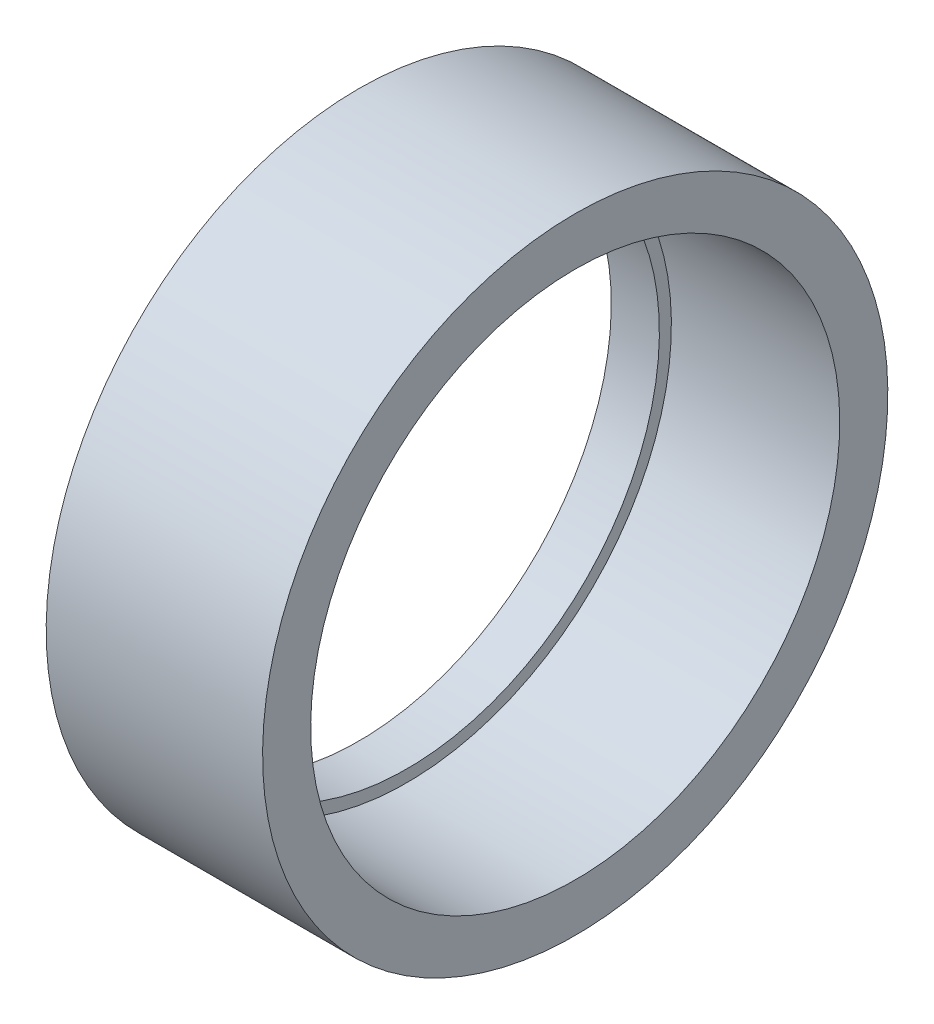
ISO-10303-21;
HEADER;
FILE_DESCRIPTION(('STEP AP214'),'2;1');
FILE_NAME('part.step','',(''),(''),'','','');
FILE_SCHEMA(('AUTOMOTIVE_DESIGN { 1 0 10303 214 1 1 1 1 }'));
ENDSEC;
DATA;
#1=APPLICATION_CONTEXT('core data for automotive mechanical design processes');
#2=APPLICATION_PROTOCOL_DEFINITION('international standard','automotive_design',2000,#1);
#3=PRODUCT_CONTEXT('',#1,'mechanical');
#4=PRODUCT('Part','Part','',(#3));
#5=PRODUCT_RELATED_PRODUCT_CATEGORY('part','',(#4));
#6=PRODUCT_DEFINITION_FORMATION('','',#4);
#7=PRODUCT_DEFINITION_CONTEXT('part definition',#1,'design');
#8=PRODUCT_DEFINITION('design','',#6,#7);
#9=PRODUCT_DEFINITION_SHAPE('','',#8);
#10=(LENGTH_UNIT() NAMED_UNIT(*) SI_UNIT(.MILLI.,.METRE.));
#11=(NAMED_UNIT(*) PLANE_ANGLE_UNIT() SI_UNIT($,.RADIAN.));
#12=(NAMED_UNIT(*) SI_UNIT($,.STERADIAN.) SOLID_ANGLE_UNIT());
#13=UNCERTAINTY_MEASURE_WITH_UNIT(LENGTH_MEASURE(1.E-05),#10,'distance_accuracy_value','');
#14=(GEOMETRIC_REPRESENTATION_CONTEXT(3) GLOBAL_UNCERTAINTY_ASSIGNED_CONTEXT((#13)) GLOBAL_UNIT_ASSIGNED_CONTEXT((#10,
#11,#12)) REPRESENTATION_CONTEXT('',''));
#15=CARTESIAN_POINT('',(0.,0.,0.));
#16=DIRECTION('',(0.,0.,1.));
#17=DIRECTION('',(1.,0.,0.));
#18=AXIS2_PLACEMENT_3D('',#15,#16,#17);
#19=CARTESIAN_POINT('',(0.,0.,0.));
#20=DIRECTION('',(1.,0.,0.));
#21=DIRECTION('',(0.,1.,0.));
#22=AXIS2_PLACEMENT_3D('',#19,#20,#21);
#23=CYLINDRICAL_SURFACE('',#22,11.);
#24=CARTESIAN_POINT('',(0.,0.,0.));
#25=DIRECTION('',(1.,0.,0.));
#26=DIRECTION('',(0.,1.,0.));
#27=AXIS2_PLACEMENT_3D('',#24,#25,#26);
#28=CIRCLE('',#27,11.);
#29=CARTESIAN_POINT('',(0.,11.,0.));
#30=VERTEX_POINT('',#29);
#31=EDGE_CURVE('E10',#30,#30,#28,.T.);
#32=ORIENTED_EDGE('',*,*,#31,.T.);
#33=EDGE_LOOP('',(#32));
#34=FACE_BOUND('',#33,.T.);
#35=CARTESIAN_POINT('',(-7.,0.,0.));
#36=DIRECTION('',(1.,0.,0.));
#37=DIRECTION('',(0.,1.,0.));
#38=AXIS2_PLACEMENT_3D('',#35,#36,#37);
#39=CIRCLE('',#38,11.);
#40=CARTESIAN_POINT('',(-7.,11.,0.));
#41=VERTEX_POINT('',#40);
#42=EDGE_CURVE('E68',#41,#41,#39,.T.);
#43=ORIENTED_EDGE('',*,*,#42,.F.);
#44=EDGE_LOOP('',(#43));
#45=FACE_BOUND('',#44,.T.);
#46=ADVANCED_FACE('F41',(#34,#45),#23,.F.);
#47=CARTESIAN_POINT('',(0.,11.,0.));
#48=DIRECTION('',(1.,0.,0.));
#49=DIRECTION('',(0.,1.,0.));
#50=AXIS2_PLACEMENT_3D('',#47,#48,#49);
#51=PLANE('',#50);
#52=CARTESIAN_POINT('',(0.,0.,0.));
#53=DIRECTION('',(1.,0.,0.));
#54=DIRECTION('',(0.,1.,0.));
#55=AXIS2_PLACEMENT_3D('',#52,#53,#54);
#56=CIRCLE('',#55,13.);
#57=CARTESIAN_POINT('',(0.,13.,0.));
#58=VERTEX_POINT('',#57);
#59=EDGE_CURVE('E48',#58,#58,#56,.T.);
#60=ORIENTED_EDGE('',*,*,#59,.T.);
#61=EDGE_LOOP('',(#60));
#62=FACE_BOUND('',#61,.T.);
#63=ORIENTED_EDGE('',*,*,#31,.F.);
#64=EDGE_LOOP('',(#63));
#65=FACE_BOUND('',#64,.T.);
#66=ADVANCED_FACE('F77',(#62,#65),#51,.T.);
#67=CARTESIAN_POINT('',(0.,0.,0.));
#68=DIRECTION('',(1.,0.,0.));
#69=DIRECTION('',(0.,1.,0.));
#70=AXIS2_PLACEMENT_3D('',#67,#68,#69);
#71=CYLINDRICAL_SURFACE('',#70,13.);
#72=CARTESIAN_POINT('',(-9.,0.,0.));
#73=DIRECTION('',(1.,0.,0.));
#74=DIRECTION('',(0.,1.,0.));
#75=AXIS2_PLACEMENT_3D('',#72,#73,#74);
#76=CIRCLE('',#75,13.);
#77=CARTESIAN_POINT('',(-9.,13.,0.));
#78=VERTEX_POINT('',#77);
#79=EDGE_CURVE('E53',#78,#78,#76,.T.);
#80=ORIENTED_EDGE('',*,*,#79,.T.);
#81=EDGE_LOOP('',(#80));
#82=FACE_BOUND('',#81,.T.);
#83=ORIENTED_EDGE('',*,*,#59,.F.);
#84=EDGE_LOOP('',(#83));
#85=FACE_BOUND('',#84,.T.);
#86=ADVANCED_FACE('F81',(#82,#85),#71,.T.);
#87=CARTESIAN_POINT('',(-9.,13.,0.));
#88=DIRECTION('',(-1.,0.,0.));
#89=DIRECTION('',(0.,-1.,0.));
#90=AXIS2_PLACEMENT_3D('',#87,#88,#89);
#91=PLANE('',#90);
#92=CARTESIAN_POINT('',(-9.,0.,0.));
#93=DIRECTION('',(1.,0.,0.));
#94=DIRECTION('',(0.,1.,0.));
#95=AXIS2_PLACEMENT_3D('',#92,#93,#94);
#96=CIRCLE('',#95,10.5);
#97=CARTESIAN_POINT('',(-9.,10.5,0.));
#98=VERTEX_POINT('',#97);
#99=EDGE_CURVE('E58',#98,#98,#96,.T.);
#100=ORIENTED_EDGE('',*,*,#99,.T.);
#101=EDGE_LOOP('',(#100));
#102=FACE_BOUND('',#101,.T.);
#103=ORIENTED_EDGE('',*,*,#79,.F.);
#104=EDGE_LOOP('',(#103));
#105=FACE_BOUND('',#104,.T.);
#106=ADVANCED_FACE('F85',(#102,#105),#91,.T.);
#107=CARTESIAN_POINT('',(0.,0.,0.));
#108=DIRECTION('',(1.,0.,0.));
#109=DIRECTION('',(0.,1.,0.));
#110=AXIS2_PLACEMENT_3D('',#107,#108,#109);
#111=CYLINDRICAL_SURFACE('',#110,10.5);
#112=CARTESIAN_POINT('',(-7.,0.,0.));
#113=DIRECTION('',(1.,0.,0.));
#114=DIRECTION('',(0.,1.,0.));
#115=AXIS2_PLACEMENT_3D('',#112,#113,#114);
#116=CIRCLE('',#115,10.5);
#117=CARTESIAN_POINT('',(-7.,10.5,0.));
#118=VERTEX_POINT('',#117);
#119=EDGE_CURVE('E64',#118,#118,#116,.T.);
#120=ORIENTED_EDGE('',*,*,#119,.T.);
#121=EDGE_LOOP('',(#120));
#122=FACE_BOUND('',#121,.T.);
#123=ORIENTED_EDGE('',*,*,#99,.F.);
#124=EDGE_LOOP('',(#123));
#125=FACE_BOUND('',#124,.T.);
#126=ADVANCED_FACE('F92',(#122,#125),#111,.F.);
#127=CARTESIAN_POINT('',(-7.,11.,0.));
#128=DIRECTION('',(1.,0.,0.));
#129=DIRECTION('',(0.,1.,0.));
#130=AXIS2_PLACEMENT_3D('',#127,#128,#129);
#131=PLANE('',#130);
#132=ORIENTED_EDGE('',*,*,#42,.T.);
#133=EDGE_LOOP('',(#132));
#134=FACE_BOUND('',#133,.T.);
#135=ORIENTED_EDGE('',*,*,#119,.F.);
#136=EDGE_LOOP('',(#135));
#137=FACE_BOUND('',#136,.T.);
#138=ADVANCED_FACE('F73',(#134,#137),#131,.T.);
#139=CLOSED_SHELL('',(#46,#66,#86,#106,#126,#138));
#140=MANIFOLD_SOLID_BREP('B2',#139);
#141=ADVANCED_BREP_SHAPE_REPRESENTATION('',(#18,#140),#14);
#142=SHAPE_DEFINITION_REPRESENTATION(#9,#141);
ENDSEC;
END-ISO-10303-21;
